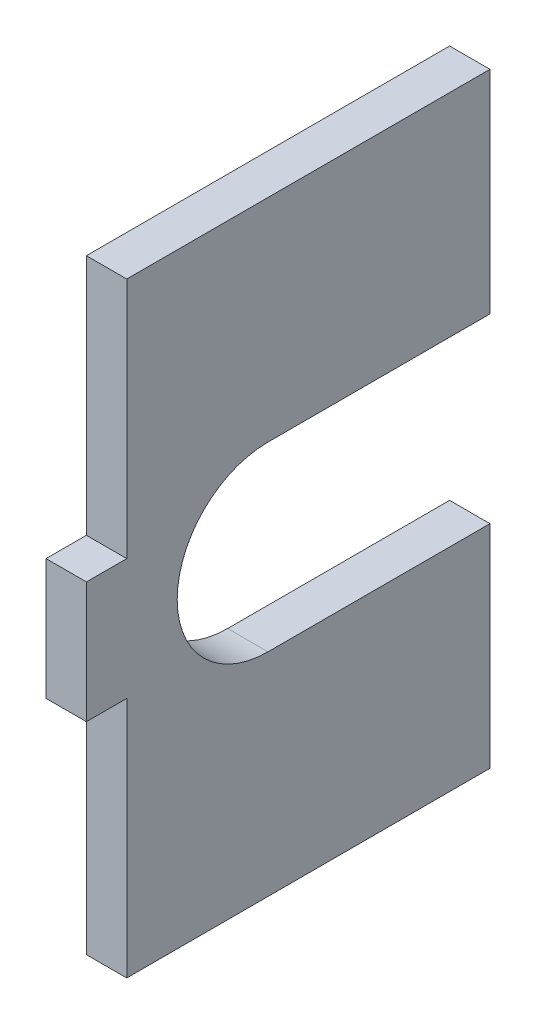
ISO-10303-21;
HEADER;
FILE_DESCRIPTION(('STEP AP214'),'2;1');
FILE_NAME('part.step','',(''),(''),'','','');
FILE_SCHEMA(('AUTOMOTIVE_DESIGN { 1 0 10303 214 1 1 1 1 }'));
ENDSEC;
DATA;
#1=APPLICATION_CONTEXT('core data for automotive mechanical design processes');
#2=APPLICATION_PROTOCOL_DEFINITION('international standard','automotive_design',2000,#1);
#3=PRODUCT_CONTEXT('',#1,'mechanical');
#4=PRODUCT('Part','Part','',(#3));
#5=PRODUCT_RELATED_PRODUCT_CATEGORY('part','',(#4));
#6=PRODUCT_DEFINITION_FORMATION('','',#4);
#7=PRODUCT_DEFINITION_CONTEXT('part definition',#1,'design');
#8=PRODUCT_DEFINITION('design','',#6,#7);
#9=PRODUCT_DEFINITION_SHAPE('','',#8);
#10=(LENGTH_UNIT() NAMED_UNIT(*) SI_UNIT(.MILLI.,.METRE.));
#11=(NAMED_UNIT(*) PLANE_ANGLE_UNIT() SI_UNIT($,.RADIAN.));
#12=(NAMED_UNIT(*) SI_UNIT($,.STERADIAN.) SOLID_ANGLE_UNIT());
#13=UNCERTAINTY_MEASURE_WITH_UNIT(LENGTH_MEASURE(1.E-05),#10,'distance_accuracy_value','');
#14=(GEOMETRIC_REPRESENTATION_CONTEXT(3) GLOBAL_UNCERTAINTY_ASSIGNED_CONTEXT((#13)) GLOBAL_UNIT_ASSIGNED_CONTEXT((#10,
#11,#12)) REPRESENTATION_CONTEXT('',''));
#15=CARTESIAN_POINT('',(0.,0.,0.));
#16=DIRECTION('',(0.,0.,1.));
#17=DIRECTION('',(1.,0.,0.));
#18=AXIS2_PLACEMENT_3D('',#15,#16,#17);
#19=CARTESIAN_POINT('',(5.5,4.99999999999491,-8.5));
#20=DIRECTION('',(0.,0.,-1.));
#21=DIRECTION('',(-1.,0.,0.));
#22=AXIS2_PLACEMENT_3D('',#19,#20,#21);
#23=PLANE('',#22);
#24=DIRECTION('',(1.,0.,0.));
#25=VECTOR('',#24,1.);
#26=CARTESIAN_POINT('',(4.5,10.9999999999956,-8.5));
#27=LINE('',#26,#25);
#28=CARTESIAN_POINT('',(4.5,10.9999999999956,-8.5));
#29=VERTEX_POINT('',#28);
#30=CARTESIAN_POINT('',(5.5,10.9999999999956,-8.5));
#31=VERTEX_POINT('',#30);
#32=EDGE_CURVE('E158',#29,#31,#27,.T.);
#33=ORIENTED_EDGE('',*,*,#32,.F.);
#34=DIRECTION('',(0.,1.,0.));
#35=VECTOR('',#34,1.);
#36=CARTESIAN_POINT('',(4.5,75.5,-8.5));
#37=LINE('',#36,#35);
#38=CARTESIAN_POINT('',(4.5,5.,-8.5));
#39=VERTEX_POINT('',#38);
#40=EDGE_CURVE('E71',#29,#39,#37,.F.);
#41=ORIENTED_EDGE('',*,*,#40,.T.);
#42=DIRECTION('',(1.,0.,0.));
#43=VECTOR('',#42,1.);
#44=CARTESIAN_POINT('',(4.5,5.,-8.5));
#45=LINE('',#44,#43);
#46=CARTESIAN_POINT('',(5.5,4.99999999999491,-8.5));
#47=VERTEX_POINT('',#46);
#48=EDGE_CURVE('E11',#39,#47,#45,.T.);
#49=ORIENTED_EDGE('',*,*,#48,.T.);
#50=DIRECTION('',(0.,1.,0.));
#51=VECTOR('',#50,1.);
#52=CARTESIAN_POINT('',(5.5,0.,-8.5));
#53=LINE('',#52,#51);
#54=EDGE_CURVE('E168',#31,#47,#53,.F.);
#55=ORIENTED_EDGE('',*,*,#54,.F.);
#56=EDGE_LOOP('',(#33,#41,#49,#55));
#57=FACE_BOUND('',#56,.T.);
#58=ADVANCED_FACE('F42',(#57),#23,.F.);
#59=CARTESIAN_POINT('',(4.5,19.9999999999992,-8.5));
#60=VERTEX_POINT('',#59);
#61=CARTESIAN_POINT('',(4.5,13.9999999999956,-8.5));
#62=VERTEX_POINT('',#61);
#63=EDGE_CURVE('E178',#60,#62,#37,.F.);
#64=ORIENTED_EDGE('',*,*,#63,.T.);
#65=DIRECTION('',(1.,0.,0.));
#66=VECTOR('',#65,1.);
#67=CARTESIAN_POINT('',(4.5,13.9999999999956,-8.5));
#68=LINE('',#67,#66);
#69=CARTESIAN_POINT('',(5.5,13.9999999999956,-8.5));
#70=VERTEX_POINT('',#69);
#71=EDGE_CURVE('E169',#62,#70,#68,.T.);
#72=ORIENTED_EDGE('',*,*,#71,.T.);
#73=CARTESIAN_POINT('',(5.5,19.9999999999962,-8.5));
#74=VERTEX_POINT('',#73);
#75=EDGE_CURVE('E179',#74,#70,#53,.F.);
#76=ORIENTED_EDGE('',*,*,#75,.F.);
#77=DIRECTION('',(1.,0.,0.));
#78=VECTOR('',#77,1.);
#79=CARTESIAN_POINT('',(4.5,20.,-8.5));
#80=LINE('',#79,#78);
#81=EDGE_CURVE('E51',#74,#60,#80,.F.);
#82=ORIENTED_EDGE('',*,*,#81,.T.);
#83=EDGE_LOOP('',(#64,#72,#76,#82));
#84=FACE_BOUND('',#83,.T.);
#85=ADVANCED_FACE('F44',(#84),#23,.F.);
#86=CARTESIAN_POINT('',(4.5,5.,-17.5));
#87=DIRECTION('',(0.,0.,1.));
#88=DIRECTION('',(0.,-1.,0.));
#89=AXIS2_PLACEMENT_3D('',#86,#87,#88);
#90=PLANE('',#89);
#91=DIRECTION('',(1.,0.,0.));
#92=VECTOR('',#91,1.);
#93=CARTESIAN_POINT('',(4.5,10.25,-17.5));
#94=LINE('',#93,#92);
#95=CARTESIAN_POINT('',(5.5,10.25,-17.5));
#96=VERTEX_POINT('',#95);
#97=CARTESIAN_POINT('',(4.5,10.25,-17.5));
#98=VERTEX_POINT('',#97);
#99=EDGE_CURVE('E219',#96,#98,#94,.F.);
#100=ORIENTED_EDGE('',*,*,#99,.F.);
#101=DIRECTION('',(0.,1.,0.));
#102=VECTOR('',#101,1.);
#103=CARTESIAN_POINT('',(5.5,0.,-17.5));
#104=LINE('',#103,#102);
#105=CARTESIAN_POINT('',(5.5,5.,-17.5));
#106=VERTEX_POINT('',#105);
#107=EDGE_CURVE('E198',#96,#106,#104,.F.);
#108=ORIENTED_EDGE('',*,*,#107,.T.);
#109=DIRECTION('',(1.,0.,0.));
#110=VECTOR('',#109,1.);
#111=CARTESIAN_POINT('',(4.5,5.,-17.5));
#112=LINE('',#111,#110);
#113=CARTESIAN_POINT('',(4.5,5.,-17.5));
#114=VERTEX_POINT('',#113);
#115=EDGE_CURVE('E222',#114,#106,#112,.T.);
#116=ORIENTED_EDGE('',*,*,#115,.F.);
#117=DIRECTION('',(0.,1.,0.));
#118=VECTOR('',#117,1.);
#119=CARTESIAN_POINT('',(4.5,0.,-17.5));
#120=LINE('',#119,#118);
#121=EDGE_CURVE('E188',#98,#114,#120,.F.);
#122=ORIENTED_EDGE('',*,*,#121,.F.);
#123=EDGE_LOOP('',(#100,#108,#116,#122));
#124=FACE_BOUND('',#123,.T.);
#125=ADVANCED_FACE('F257',(#124),#90,.F.);
#126=CARTESIAN_POINT('',(4.5,5.,-17.5));
#127=DIRECTION('',(0.,0.,1.));
#128=DIRECTION('',(0.,-1.,0.));
#129=AXIS2_PLACEMENT_3D('',#126,#127,#128);
#130=PLANE('',#129);
#131=DIRECTION('',(1.,0.,0.));
#132=VECTOR('',#131,1.);
#133=CARTESIAN_POINT('',(80.0500000999999,14.75,-17.5));
#134=LINE('',#133,#132);
#135=CARTESIAN_POINT('',(5.5,14.75,-17.5));
#136=VERTEX_POINT('',#135);
#137=CARTESIAN_POINT('',(4.5,14.75,-17.5));
#138=VERTEX_POINT('',#137);
#139=EDGE_CURVE('E229',#136,#138,#134,.F.);
#140=ORIENTED_EDGE('',*,*,#139,.T.);
#141=DIRECTION('',(0.,1.,0.));
#142=VECTOR('',#141,1.);
#143=CARTESIAN_POINT('',(4.5,0.,-17.5));
#144=LINE('',#143,#142);
#145=CARTESIAN_POINT('',(4.5,20.,-17.5));
#146=VERTEX_POINT('',#145);
#147=EDGE_CURVE('E217',#146,#138,#144,.F.);
#148=ORIENTED_EDGE('',*,*,#147,.F.);
#149=DIRECTION('',(1.,0.,0.));
#150=VECTOR('',#149,1.);
#151=CARTESIAN_POINT('',(4.5,20.,-17.5));
#152=LINE('',#151,#150);
#153=CARTESIAN_POINT('',(5.5,19.999999999995,-17.5));
#154=VERTEX_POINT('',#153);
#155=EDGE_CURVE('E231',#154,#146,#152,.F.);
#156=ORIENTED_EDGE('',*,*,#155,.F.);
#157=DIRECTION('',(0.,1.,0.));
#158=VECTOR('',#157,1.);
#159=CARTESIAN_POINT('',(5.5,0.,-17.5));
#160=LINE('',#159,#158);
#161=EDGE_CURVE('E201',#154,#136,#160,.F.);
#162=ORIENTED_EDGE('',*,*,#161,.T.);
#163=EDGE_LOOP('',(#140,#148,#156,#162));
#164=FACE_BOUND('',#163,.T.);
#165=ADVANCED_FACE('F246',(#164),#130,.F.);
#166=CARTESIAN_POINT('',(80.0500000999999,14.75,-12.));
#167=DIRECTION('',(0.,1.,0.));
#168=DIRECTION('',(0.,0.,1.));
#169=AXIS2_PLACEMENT_3D('',#166,#167,#168);
#170=PLANE('',#169);
#171=DIRECTION('',(0.,0.,1.));
#172=VECTOR('',#171,1.);
#173=CARTESIAN_POINT('',(4.5,14.75,0.));
#174=LINE('',#173,#172);
#175=CARTESIAN_POINT('',(4.5,14.75,-12.));
#176=VERTEX_POINT('',#175);
#177=EDGE_CURVE('E215',#138,#176,#174,.T.);
#178=ORIENTED_EDGE('',*,*,#177,.F.);
#179=ORIENTED_EDGE('',*,*,#139,.F.);
#180=DIRECTION('',(0.,0.,1.));
#181=VECTOR('',#180,1.);
#182=CARTESIAN_POINT('',(5.5,14.75,0.));
#183=LINE('',#182,#181);
#184=CARTESIAN_POINT('',(5.50000000000001,14.75,-12.));
#185=VERTEX_POINT('',#184);
#186=EDGE_CURVE('E194',#136,#185,#183,.T.);
#187=ORIENTED_EDGE('',*,*,#186,.T.);
#188=DIRECTION('',(-1.,0.,0.));
#189=VECTOR('',#188,1.);
#190=CARTESIAN_POINT('',(80.0500000999999,14.75,-12.));
#191=LINE('',#190,#189);
#192=EDGE_CURVE('E223',#185,#176,#191,.T.);
#193=ORIENTED_EDGE('',*,*,#192,.T.);
#194=EDGE_LOOP('',(#178,#179,#187,#193));
#195=FACE_BOUND('',#194,.T.);
#196=ADVANCED_FACE('F248',(#195),#170,.F.);
#197=CARTESIAN_POINT('',(80.0500000999999,12.5,-12.));
#198=DIRECTION('',(-1.,0.,0.));
#199=DIRECTION('',(0.,0.,1.));
#200=AXIS2_PLACEMENT_3D('',#197,#198,#199);
#201=CYLINDRICAL_SURFACE('',#200,2.25);
#202=CARTESIAN_POINT('',(5.50000000000001,12.5,-12.));
#203=DIRECTION('',(-1.,0.,0.));
#204=DIRECTION('',(0.,0.,1.));
#205=AXIS2_PLACEMENT_3D('',#202,#203,#204);
#206=CIRCLE('',#205,2.25);
#207=CARTESIAN_POINT('',(5.5,10.25,-12.));
#208=VERTEX_POINT('',#207);
#209=EDGE_CURVE('E191',#185,#208,#206,.F.);
#210=ORIENTED_EDGE('',*,*,#209,.T.);
#211=DIRECTION('',(1.,0.,0.));
#212=VECTOR('',#211,1.);
#213=CARTESIAN_POINT('',(80.0500000999999,10.25,-12.));
#214=LINE('',#213,#212);
#215=CARTESIAN_POINT('',(4.5,10.25,-12.));
#216=VERTEX_POINT('',#215);
#217=EDGE_CURVE('E220',#208,#216,#214,.F.);
#218=ORIENTED_EDGE('',*,*,#217,.T.);
#219=CARTESIAN_POINT('',(4.5,12.5,-12.));
#220=DIRECTION('',(-1.,0.,0.));
#221=DIRECTION('',(0.,0.,1.));
#222=AXIS2_PLACEMENT_3D('',#219,#220,#221);
#223=CIRCLE('',#222,2.25);
#224=EDGE_CURVE('E46',#176,#216,#223,.F.);
#225=ORIENTED_EDGE('',*,*,#224,.F.);
#226=ORIENTED_EDGE('',*,*,#192,.F.);
#227=EDGE_LOOP('',(#210,#218,#225,#226));
#228=FACE_BOUND('',#227,.T.);
#229=ADVANCED_FACE('F277',(#228),#201,.F.);
#230=CARTESIAN_POINT('',(80.0500000999999,10.25,-12.));
#231=DIRECTION('',(0.,-1.,0.));
#232=DIRECTION('',(1.,0.,0.));
#233=AXIS2_PLACEMENT_3D('',#230,#231,#232);
#234=PLANE('',#233);
#235=DIRECTION('',(0.,0.,1.));
#236=VECTOR('',#235,1.);
#237=CARTESIAN_POINT('',(4.5,10.25,0.));
#238=LINE('',#237,#236);
#239=EDGE_CURVE('E190',#216,#98,#238,.F.);
#240=ORIENTED_EDGE('',*,*,#239,.F.);
#241=ORIENTED_EDGE('',*,*,#217,.F.);
#242=DIRECTION('',(0.,0.,1.));
#243=VECTOR('',#242,1.);
#244=CARTESIAN_POINT('',(5.5,10.25,0.));
#245=LINE('',#244,#243);
#246=EDGE_CURVE('E193',#208,#96,#245,.F.);
#247=ORIENTED_EDGE('',*,*,#246,.T.);
#248=ORIENTED_EDGE('',*,*,#99,.T.);
#249=EDGE_LOOP('',(#240,#241,#247,#248));
#250=FACE_BOUND('',#249,.T.);
#251=ADVANCED_FACE('F252',(#250),#234,.F.);
#252=CARTESIAN_POINT('',(4.5,5.,17.5));
#253=DIRECTION('',(0.,1.,0.));
#254=DIRECTION('',(0.,0.,1.));
#255=AXIS2_PLACEMENT_3D('',#252,#253,#254);
#256=PLANE('',#255);
#257=ORIENTED_EDGE('',*,*,#48,.F.);
#258=DIRECTION('',(0.,0.,1.));
#259=VECTOR('',#258,1.);
#260=CARTESIAN_POINT('',(4.5,5.,0.));
#261=LINE('',#260,#259);
#262=EDGE_CURVE('E177',#114,#39,#261,.T.);
#263=ORIENTED_EDGE('',*,*,#262,.F.);
#264=ORIENTED_EDGE('',*,*,#115,.T.);
#265=DIRECTION('',(0.,0.,1.));
#266=VECTOR('',#265,1.);
#267=CARTESIAN_POINT('',(5.5,5.,0.));
#268=LINE('',#267,#266);
#269=EDGE_CURVE('E210',#106,#47,#268,.T.);
#270=ORIENTED_EDGE('',*,*,#269,.T.);
#271=EDGE_LOOP('',(#257,#263,#264,#270));
#272=FACE_BOUND('',#271,.T.);
#273=ADVANCED_FACE('F259',(#272),#256,.F.);
#274=CARTESIAN_POINT('',(4.5,0.,0.));
#275=DIRECTION('',(-1.,0.,0.));
#276=DIRECTION('',(0.,0.,1.));
#277=AXIS2_PLACEMENT_3D('',#274,#275,#276);
#278=PLANE('',#277);
#279=ORIENTED_EDGE('',*,*,#177,.T.);
#280=ORIENTED_EDGE('',*,*,#224,.T.);
#281=ORIENTED_EDGE('',*,*,#239,.T.);
#282=ORIENTED_EDGE('',*,*,#121,.T.);
#283=ORIENTED_EDGE('',*,*,#262,.T.);
#284=ORIENTED_EDGE('',*,*,#40,.F.);
#285=DIRECTION('',(0.,0.,-1.));
#286=VECTOR('',#285,1.);
#287=CARTESIAN_POINT('',(4.5,10.9999999999956,-8.5));
#288=LINE('',#287,#286);
#289=CARTESIAN_POINT('',(4.5,10.9999999999956,-7.5));
#290=VERTEX_POINT('',#289);
#291=EDGE_CURVE('E155',#290,#29,#288,.T.);
#292=ORIENTED_EDGE('',*,*,#291,.F.);
#293=DIRECTION('',(0.,-1.,0.));
#294=VECTOR('',#293,1.);
#295=CARTESIAN_POINT('',(4.5,10.9999999999956,-7.5));
#296=LINE('',#295,#294);
#297=CARTESIAN_POINT('',(4.5,13.9999999999956,-7.5));
#298=VERTEX_POINT('',#297);
#299=EDGE_CURVE('E170',#298,#290,#296,.T.);
#300=ORIENTED_EDGE('',*,*,#299,.F.);
#301=DIRECTION('',(0.,0.,1.));
#302=VECTOR('',#301,1.);
#303=CARTESIAN_POINT('',(4.5,13.9999999999956,-8.5));
#304=LINE('',#303,#302);
#305=EDGE_CURVE('E164',#62,#298,#304,.T.);
#306=ORIENTED_EDGE('',*,*,#305,.F.);
#307=ORIENTED_EDGE('',*,*,#63,.F.);
#308=DIRECTION('',(0.,0.,1.));
#309=VECTOR('',#308,1.);
#310=CARTESIAN_POINT('',(4.5,20.,0.));
#311=LINE('',#310,#309);
#312=EDGE_CURVE('E186',#60,#146,#311,.F.);
#313=ORIENTED_EDGE('',*,*,#312,.T.);
#314=ORIENTED_EDGE('',*,*,#147,.T.);
#315=EDGE_LOOP('',(#279,#280,#281,#282,#283,#284,#292,#300,#306,#307,#313,#314));
#316=FACE_BOUND('',#315,.T.);
#317=ADVANCED_FACE('F174',(#316),#278,.T.);
#318=CARTESIAN_POINT('',(4.5,20.,17.5));
#319=DIRECTION('',(0.,-1.,0.));
#320=DIRECTION('',(0.,0.,-1.));
#321=AXIS2_PLACEMENT_3D('',#318,#319,#320);
#322=PLANE('',#321);
#323=ORIENTED_EDGE('',*,*,#81,.F.);
#324=DIRECTION('',(0.,0.,1.));
#325=VECTOR('',#324,1.);
#326=CARTESIAN_POINT('',(5.5,19.9999999999924,0.));
#327=LINE('',#326,#325);
#328=EDGE_CURVE('E207',#74,#154,#327,.F.);
#329=ORIENTED_EDGE('',*,*,#328,.T.);
#330=ORIENTED_EDGE('',*,*,#155,.T.);
#331=ORIENTED_EDGE('',*,*,#312,.F.);
#332=EDGE_LOOP('',(#323,#329,#330,#331));
#333=FACE_BOUND('',#332,.T.);
#334=ADVANCED_FACE('F242',(#333),#322,.F.);
#335=CARTESIAN_POINT('',(5.5,0.,0.));
#336=DIRECTION('',(-1.,0.,0.));
#337=DIRECTION('',(0.,0.,1.));
#338=AXIS2_PLACEMENT_3D('',#335,#336,#337);
#339=PLANE('',#338);
#340=ORIENTED_EDGE('',*,*,#246,.F.);
#341=ORIENTED_EDGE('',*,*,#209,.F.);
#342=ORIENTED_EDGE('',*,*,#186,.F.);
#343=ORIENTED_EDGE('',*,*,#161,.F.);
#344=ORIENTED_EDGE('',*,*,#328,.F.);
#345=ORIENTED_EDGE('',*,*,#75,.T.);
#346=DIRECTION('',(0.,0.,1.));
#347=VECTOR('',#346,1.);
#348=CARTESIAN_POINT('',(5.5,13.9999999999956,-8.5));
#349=LINE('',#348,#347);
#350=CARTESIAN_POINT('',(5.5,13.9999999999956,-7.5));
#351=VERTEX_POINT('',#350);
#352=EDGE_CURVE('E62',#70,#351,#349,.T.);
#353=ORIENTED_EDGE('',*,*,#352,.T.);
#354=DIRECTION('',(0.,-1.,0.));
#355=VECTOR('',#354,1.);
#356=CARTESIAN_POINT('',(5.5,10.9999999999956,-7.5));
#357=LINE('',#356,#355);
#358=CARTESIAN_POINT('',(5.5,10.9999999999956,-7.5));
#359=VERTEX_POINT('',#358);
#360=EDGE_CURVE('E165',#351,#359,#357,.T.);
#361=ORIENTED_EDGE('',*,*,#360,.T.);
#362=DIRECTION('',(0.,0.,-1.));
#363=VECTOR('',#362,1.);
#364=CARTESIAN_POINT('',(5.5,10.9999999999956,-8.5));
#365=LINE('',#364,#363);
#366=EDGE_CURVE('E263',#359,#31,#365,.T.);
#367=ORIENTED_EDGE('',*,*,#366,.T.);
#368=ORIENTED_EDGE('',*,*,#54,.T.);
#369=ORIENTED_EDGE('',*,*,#269,.F.);
#370=ORIENTED_EDGE('',*,*,#107,.F.);
#371=EDGE_LOOP('',(#340,#341,#342,#343,#344,#345,#353,#361,#367,#368,#369,#370));
#372=FACE_BOUND('',#371,.T.);
#373=ADVANCED_FACE('F261',(#372),#339,.F.);
#374=CARTESIAN_POINT('',(4.5,10.9999999999956,-8.5));
#375=DIRECTION('',(0.,-1.,0.));
#376=DIRECTION('',(1.,0.,0.));
#377=AXIS2_PLACEMENT_3D('',#374,#375,#376);
#378=PLANE('',#377);
#379=ORIENTED_EDGE('',*,*,#366,.F.);
#380=DIRECTION('',(1.,0.,0.));
#381=VECTOR('',#380,1.);
#382=CARTESIAN_POINT('',(4.5,10.9999999999956,-7.5));
#383=LINE('',#382,#381);
#384=EDGE_CURVE('E160',#290,#359,#383,.T.);
#385=ORIENTED_EDGE('',*,*,#384,.F.);
#386=ORIENTED_EDGE('',*,*,#291,.T.);
#387=ORIENTED_EDGE('',*,*,#32,.T.);
#388=EDGE_LOOP('',(#379,#385,#386,#387));
#389=FACE_BOUND('',#388,.T.);
#390=ADVANCED_FACE('F157',(#389),#378,.T.);
#391=CARTESIAN_POINT('',(4.5,10.9999999999956,-7.5));
#392=DIRECTION('',(0.,0.,1.));
#393=DIRECTION('',(1.,0.,0.));
#394=AXIS2_PLACEMENT_3D('',#391,#392,#393);
#395=PLANE('',#394);
#396=ORIENTED_EDGE('',*,*,#360,.F.);
#397=DIRECTION('',(1.,0.,0.));
#398=VECTOR('',#397,1.);
#399=CARTESIAN_POINT('',(4.5,13.9999999999956,-7.5));
#400=LINE('',#399,#398);
#401=EDGE_CURVE('E272',#298,#351,#400,.T.);
#402=ORIENTED_EDGE('',*,*,#401,.F.);
#403=ORIENTED_EDGE('',*,*,#299,.T.);
#404=ORIENTED_EDGE('',*,*,#384,.T.);
#405=EDGE_LOOP('',(#396,#402,#403,#404));
#406=FACE_BOUND('',#405,.T.);
#407=ADVANCED_FACE('F305',(#406),#395,.T.);
#408=CARTESIAN_POINT('',(4.5,13.9999999999956,-8.5));
#409=DIRECTION('',(0.,1.,0.));
#410=DIRECTION('',(-1.,0.,0.));
#411=AXIS2_PLACEMENT_3D('',#408,#409,#410);
#412=PLANE('',#411);
#413=ORIENTED_EDGE('',*,*,#352,.F.);
#414=ORIENTED_EDGE('',*,*,#71,.F.);
#415=ORIENTED_EDGE('',*,*,#305,.T.);
#416=ORIENTED_EDGE('',*,*,#401,.T.);
#417=EDGE_LOOP('',(#413,#414,#415,#416));
#418=FACE_BOUND('',#417,.T.);
#419=ADVANCED_FACE('F306',(#418),#412,.T.);
#420=CLOSED_SHELL('',(#58,#85,#125,#165,#196,#229,#251,#273,#317,#334,#373,#390,#407,#419));
#421=MANIFOLD_SOLID_BREP('B2',#420);
#422=ADVANCED_BREP_SHAPE_REPRESENTATION('',(#18,#421),#14);
#423=SHAPE_DEFINITION_REPRESENTATION(#9,#422);
ENDSEC;
END-ISO-10303-21;
